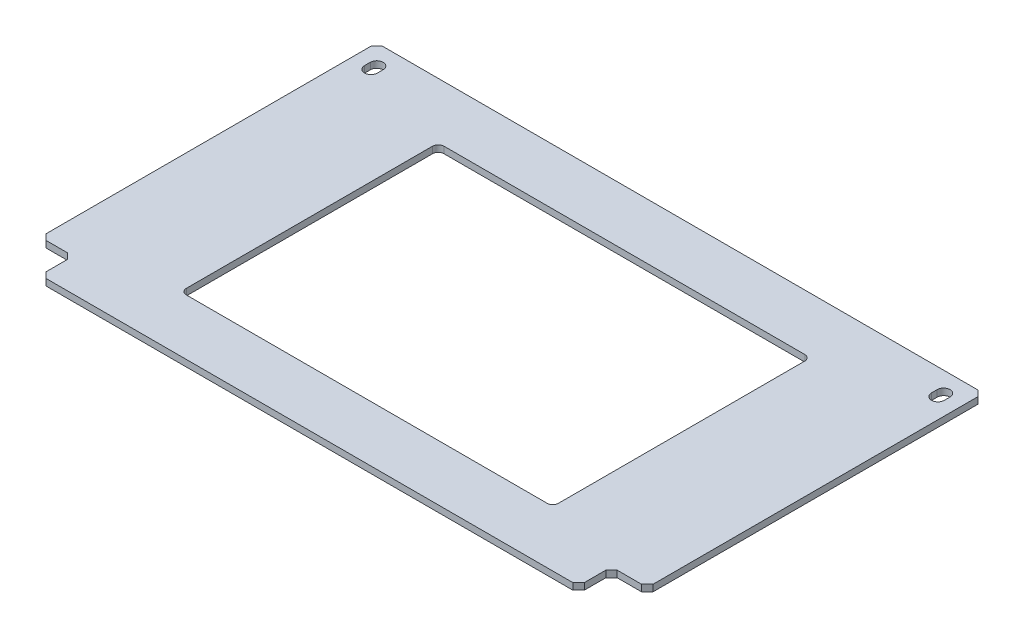
ISO-10303-21;
HEADER;
FILE_DESCRIPTION(('STEP AP214'),'2;1');
FILE_NAME('part.step','',(''),(''),'','','');
FILE_SCHEMA(('AUTOMOTIVE_DESIGN { 1 0 10303 214 1 1 1 1 }'));
ENDSEC;
DATA;
#1=APPLICATION_CONTEXT('core data for automotive mechanical design processes');
#2=APPLICATION_PROTOCOL_DEFINITION('international standard','automotive_design',2000,#1);
#3=PRODUCT_CONTEXT('',#1,'mechanical');
#4=PRODUCT('Part','Part','',(#3));
#5=PRODUCT_RELATED_PRODUCT_CATEGORY('part','',(#4));
#6=PRODUCT_DEFINITION_FORMATION('','',#4);
#7=PRODUCT_DEFINITION_CONTEXT('part definition',#1,'design');
#8=PRODUCT_DEFINITION('design','',#6,#7);
#9=PRODUCT_DEFINITION_SHAPE('','',#8);
#10=(LENGTH_UNIT() NAMED_UNIT(*) SI_UNIT(.MILLI.,.METRE.));
#11=(NAMED_UNIT(*) PLANE_ANGLE_UNIT() SI_UNIT($,.RADIAN.));
#12=(NAMED_UNIT(*) SI_UNIT($,.STERADIAN.) SOLID_ANGLE_UNIT());
#13=UNCERTAINTY_MEASURE_WITH_UNIT(LENGTH_MEASURE(1.E-05),#10,'distance_accuracy_value','');
#14=(GEOMETRIC_REPRESENTATION_CONTEXT(3) GLOBAL_UNCERTAINTY_ASSIGNED_CONTEXT((#13)) GLOBAL_UNIT_ASSIGNED_CONTEXT((#10,
#11,#12)) REPRESENTATION_CONTEXT('',''));
#15=CARTESIAN_POINT('',(0.,0.,0.));
#16=DIRECTION('',(0.,0.,1.));
#17=DIRECTION('',(1.,0.,0.));
#18=AXIS2_PLACEMENT_3D('',#15,#16,#17);
#19=CARTESIAN_POINT('',(101.25,2.5,-122.));
#20=DIRECTION('',(-1.,0.,0.));
#21=DIRECTION('',(0.,0.,-1.));
#22=AXIS2_PLACEMENT_3D('',#19,#20,#21);
#23=PLANE('',#22);
#24=DIRECTION('',(0.,1.,0.));
#25=VECTOR('',#24,1.);
#26=CARTESIAN_POINT('',(101.25,2.5,-122.));
#27=LINE('',#26,#25);
#28=CARTESIAN_POINT('',(101.25,0.2,-122.));
#29=VERTEX_POINT('',#28);
#30=CARTESIAN_POINT('',(101.25,2.5,-122.));
#31=VERTEX_POINT('',#30);
#32=EDGE_CURVE('E429',#29,#31,#27,.T.);
#33=ORIENTED_EDGE('',*,*,#32,.F.);
#34=DIRECTION('',(0.,0.,-1.));
#35=VECTOR('',#34,1.);
#36=CARTESIAN_POINT('',(101.25,0.2,-129.));
#37=LINE('',#36,#35);
#38=CARTESIAN_POINT('',(101.25,0.2,-120.));
#39=VERTEX_POINT('',#38);
#40=EDGE_CURVE('E383',#39,#29,#37,.T.);
#41=ORIENTED_EDGE('',*,*,#40,.F.);
#42=DIRECTION('',(0.,1.,0.));
#43=VECTOR('',#42,1.);
#44=CARTESIAN_POINT('',(101.25,2.5,-120.));
#45=LINE('',#44,#43);
#46=CARTESIAN_POINT('',(101.25,2.5,-120.));
#47=VERTEX_POINT('',#46);
#48=EDGE_CURVE('E427',#39,#47,#45,.T.);
#49=ORIENTED_EDGE('',*,*,#48,.T.);
#50=DIRECTION('',(0.,0.,-1.));
#51=VECTOR('',#50,1.);
#52=CARTESIAN_POINT('',(101.25,2.5,-122.));
#53=LINE('',#52,#51);
#54=EDGE_CURVE('E314',#47,#31,#53,.T.);
#55=ORIENTED_EDGE('',*,*,#54,.T.);
#56=EDGE_LOOP('',(#33,#41,#49,#55));
#57=FACE_BOUND('',#56,.T.);
#58=ADVANCED_FACE('F17',(#57),#23,.T.);
#59=CARTESIAN_POINT('',(99.,2.5,-120.));
#60=DIRECTION('',(0.,1.,0.));
#61=DIRECTION('',(0.,0.,1.));
#62=AXIS2_PLACEMENT_3D('',#59,#60,#61);
#63=CYLINDRICAL_SURFACE('',#62,2.25);
#64=ORIENTED_EDGE('',*,*,#48,.F.);
#65=CARTESIAN_POINT('',(99.,0.2,-120.));
#66=DIRECTION('',(0.,1.,0.));
#67=DIRECTION('',(0.,0.,1.));
#68=AXIS2_PLACEMENT_3D('',#65,#66,#67);
#69=CIRCLE('',#68,2.25);
#70=CARTESIAN_POINT('',(96.75,0.2,-120.));
#71=VERTEX_POINT('',#70);
#72=EDGE_CURVE('E250',#71,#39,#69,.T.);
#73=ORIENTED_EDGE('',*,*,#72,.F.);
#74=DIRECTION('',(0.,1.,0.));
#75=VECTOR('',#74,1.);
#76=CARTESIAN_POINT('',(96.75,2.5,-120.));
#77=LINE('',#76,#75);
#78=CARTESIAN_POINT('',(96.75,2.5,-120.));
#79=VERTEX_POINT('',#78);
#80=EDGE_CURVE('E425',#71,#79,#77,.T.);
#81=ORIENTED_EDGE('',*,*,#80,.T.);
#82=CARTESIAN_POINT('',(99.,2.5,-120.));
#83=DIRECTION('',(0.,1.,0.));
#84=DIRECTION('',(0.,0.,1.));
#85=AXIS2_PLACEMENT_3D('',#82,#83,#84);
#86=CIRCLE('',#85,2.25);
#87=EDGE_CURVE('E239',#79,#47,#86,.T.);
#88=ORIENTED_EDGE('',*,*,#87,.T.);
#89=EDGE_LOOP('',(#64,#73,#81,#88));
#90=FACE_BOUND('',#89,.T.);
#91=ADVANCED_FACE('F516',(#90),#63,.F.);
#92=CARTESIAN_POINT('',(96.75,2.5,-122.));
#93=DIRECTION('',(1.,0.,0.));
#94=DIRECTION('',(0.,0.,1.));
#95=AXIS2_PLACEMENT_3D('',#92,#93,#94);
#96=PLANE('',#95);
#97=ORIENTED_EDGE('',*,*,#80,.F.);
#98=DIRECTION('',(0.,0.,-1.));
#99=VECTOR('',#98,1.);
#100=CARTESIAN_POINT('',(96.75,0.2,-129.));
#101=LINE('',#100,#99);
#102=CARTESIAN_POINT('',(96.75,0.2,-122.));
#103=VERTEX_POINT('',#102);
#104=EDGE_CURVE('E336',#103,#71,#101,.F.);
#105=ORIENTED_EDGE('',*,*,#104,.F.);
#106=DIRECTION('',(0.,1.,0.));
#107=VECTOR('',#106,1.);
#108=CARTESIAN_POINT('',(96.75,2.5,-122.));
#109=LINE('',#108,#107);
#110=CARTESIAN_POINT('',(96.75,2.5,-122.));
#111=VERTEX_POINT('',#110);
#112=EDGE_CURVE('E423',#103,#111,#109,.T.);
#113=ORIENTED_EDGE('',*,*,#112,.T.);
#114=DIRECTION('',(0.,0.,1.));
#115=VECTOR('',#114,1.);
#116=CARTESIAN_POINT('',(96.75,2.5,-122.));
#117=LINE('',#116,#115);
#118=EDGE_CURVE('E308',#111,#79,#117,.T.);
#119=ORIENTED_EDGE('',*,*,#118,.T.);
#120=EDGE_LOOP('',(#97,#105,#113,#119));
#121=FACE_BOUND('',#120,.T.);
#122=ADVANCED_FACE('F523',(#121),#96,.T.);
#123=CARTESIAN_POINT('',(-106.,2.5,0.));
#124=DIRECTION('',(-1.,0.,0.));
#125=DIRECTION('',(0.,0.,-1.));
#126=AXIS2_PLACEMENT_3D('',#123,#124,#125);
#127=PLANE('',#126);
#128=DIRECTION('',(0.,1.,0.));
#129=VECTOR('',#128,1.);
#130=CARTESIAN_POINT('',(-106.,2.5,-127.));
#131=LINE('',#130,#129);
#132=CARTESIAN_POINT('',(-106.,0.2,-127.));
#133=VERTEX_POINT('',#132);
#134=CARTESIAN_POINT('',(-106.,2.5,-127.));
#135=VERTEX_POINT('',#134);
#136=EDGE_CURVE('E421',#133,#135,#131,.T.);
#137=ORIENTED_EDGE('',*,*,#136,.F.);
#138=DIRECTION('',(0.,0.,-1.));
#139=VECTOR('',#138,1.);
#140=CARTESIAN_POINT('',(-106.,0.2,-129.));
#141=LINE('',#140,#139);
#142=CARTESIAN_POINT('',(-106.,0.2,-13.5));
#143=VERTEX_POINT('',#142);
#144=EDGE_CURVE('E373',#143,#133,#141,.T.);
#145=ORIENTED_EDGE('',*,*,#144,.F.);
#146=DIRECTION('',(0.,1.,0.));
#147=VECTOR('',#146,1.);
#148=CARTESIAN_POINT('',(-106.,2.5,-13.5));
#149=LINE('',#148,#147);
#150=CARTESIAN_POINT('',(-106.,2.5,-13.5));
#151=VERTEX_POINT('',#150);
#152=EDGE_CURVE('E419',#143,#151,#149,.T.);
#153=ORIENTED_EDGE('',*,*,#152,.T.);
#154=DIRECTION('',(0.,0.,-1.));
#155=VECTOR('',#154,1.);
#156=CARTESIAN_POINT('',(-106.,2.5,0.));
#157=LINE('',#156,#155);
#158=EDGE_CURVE('E266',#151,#135,#157,.T.);
#159=ORIENTED_EDGE('',*,*,#158,.T.);
#160=EDGE_LOOP('',(#137,#145,#153,#159));
#161=FACE_BOUND('',#160,.T.);
#162=ADVANCED_FACE('F626',(#161),#127,.T.);
#163=CARTESIAN_POINT('',(-106.,2.5,-13.5));
#164=DIRECTION('',(-0.707106781186543,0.,0.707106781186553));
#165=DIRECTION('',(-0.707106781186553,0.,-0.707106781186543));
#166=AXIS2_PLACEMENT_3D('',#163,#164,#165);
#167=PLANE('',#166);
#168=ORIENTED_EDGE('',*,*,#152,.F.);
#169=DIRECTION('',(-0.707106781186553,0.,-0.707106781186543));
#170=VECTOR('',#169,1.);
#171=CARTESIAN_POINT('',(-106.,0.2,-13.5));
#172=LINE('',#171,#170);
#173=CARTESIAN_POINT('',(-104.,0.2,-11.5));
#174=VERTEX_POINT('',#173);
#175=EDGE_CURVE('E370',#143,#174,#172,.F.);
#176=ORIENTED_EDGE('',*,*,#175,.T.);
#177=DIRECTION('',(0.,1.,0.));
#178=VECTOR('',#177,1.);
#179=CARTESIAN_POINT('',(-104.,2.5,-11.5));
#180=LINE('',#179,#178);
#181=CARTESIAN_POINT('',(-104.,2.5,-11.5));
#182=VERTEX_POINT('',#181);
#183=EDGE_CURVE('E417',#174,#182,#180,.T.);
#184=ORIENTED_EDGE('',*,*,#183,.T.);
#185=DIRECTION('',(-0.707106781186553,0.,-0.707106781186543));
#186=VECTOR('',#185,1.);
#187=CARTESIAN_POINT('',(-106.,2.5,-13.5));
#188=LINE('',#187,#186);
#189=EDGE_CURVE('E269',#151,#182,#188,.F.);
#190=ORIENTED_EDGE('',*,*,#189,.F.);
#191=EDGE_LOOP('',(#168,#176,#184,#190));
#192=FACE_BOUND('',#191,.T.);
#193=ADVANCED_FACE('F622',(#192),#167,.T.);
#194=CARTESIAN_POINT('',(-106.,2.5,-11.5));
#195=DIRECTION('',(0.,0.,-1.));
#196=DIRECTION('',(1.,0.,0.));
#197=AXIS2_PLACEMENT_3D('',#194,#195,#196);
#198=PLANE('',#197);
#199=ORIENTED_EDGE('',*,*,#183,.F.);
#200=DIRECTION('',(1.,0.,0.));
#201=VECTOR('',#200,1.);
#202=CARTESIAN_POINT('',(0.,0.2,-11.5));
#203=LINE('',#202,#201);
#204=CARTESIAN_POINT('',(-96.5,0.2,-11.5));
#205=VERTEX_POINT('',#204);
#206=EDGE_CURVE('E367',#174,#205,#203,.T.);
#207=ORIENTED_EDGE('',*,*,#206,.T.);
#208=DIRECTION('',(0.,1.,0.));
#209=VECTOR('',#208,1.);
#210=CARTESIAN_POINT('',(-96.5,2.5,-11.5));
#211=LINE('',#210,#209);
#212=CARTESIAN_POINT('',(-96.5,2.5,-11.5));
#213=VERTEX_POINT('',#212);
#214=EDGE_CURVE('E415',#205,#213,#211,.T.);
#215=ORIENTED_EDGE('',*,*,#214,.T.);
#216=DIRECTION('',(1.,0.,0.));
#217=VECTOR('',#216,1.);
#218=CARTESIAN_POINT('',(-106.,2.5,-11.5));
#219=LINE('',#218,#217);
#220=EDGE_CURVE('E272',#182,#213,#219,.T.);
#221=ORIENTED_EDGE('',*,*,#220,.F.);
#222=EDGE_LOOP('',(#199,#207,#215,#221));
#223=FACE_BOUND('',#222,.T.);
#224=ADVANCED_FACE('F618',(#223),#198,.F.);
#225=CARTESIAN_POINT('',(-106.999999999999,2.5,-21.9999999999984));
#226=DIRECTION('',(-0.707106781186538,0.,0.707106781186557));
#227=DIRECTION('',(-0.707106781186557,0.,-0.707106781186538));
#228=AXIS2_PLACEMENT_3D('',#225,#226,#227);
#229=PLANE('',#228);
#230=ORIENTED_EDGE('',*,*,#214,.F.);
#231=DIRECTION('',(-0.707106781186557,0.,-0.707106781186538));
#232=VECTOR('',#231,1.);
#233=CARTESIAN_POINT('',(-106.999999999999,0.2,-21.9999999999984));
#234=LINE('',#233,#232);
#235=CARTESIAN_POINT('',(-94.5,0.2,-9.5));
#236=VERTEX_POINT('',#235);
#237=EDGE_CURVE('E364',#205,#236,#234,.F.);
#238=ORIENTED_EDGE('',*,*,#237,.T.);
#239=DIRECTION('',(0.,1.,0.));
#240=VECTOR('',#239,1.);
#241=CARTESIAN_POINT('',(-94.5,2.5,-9.5));
#242=LINE('',#241,#240);
#243=CARTESIAN_POINT('',(-94.5,2.5,-9.5));
#244=VERTEX_POINT('',#243);
#245=EDGE_CURVE('E413',#236,#244,#242,.T.);
#246=ORIENTED_EDGE('',*,*,#245,.T.);
#247=DIRECTION('',(-0.707106781186557,0.,-0.707106781186538));
#248=VECTOR('',#247,1.);
#249=CARTESIAN_POINT('',(-106.999999999999,2.5,-21.9999999999984));
#250=LINE('',#249,#248);
#251=EDGE_CURVE('E275',#213,#244,#250,.F.);
#252=ORIENTED_EDGE('',*,*,#251,.F.);
#253=EDGE_LOOP('',(#230,#238,#246,#252));
#254=FACE_BOUND('',#253,.T.);
#255=ADVANCED_FACE('F614',(#254),#229,.T.);
#256=CARTESIAN_POINT('',(-94.5,2.5,-11.5));
#257=DIRECTION('',(1.,0.,0.));
#258=DIRECTION('',(0.,0.,1.));
#259=AXIS2_PLACEMENT_3D('',#256,#257,#258);
#260=PLANE('',#259);
#261=ORIENTED_EDGE('',*,*,#245,.F.);
#262=DIRECTION('',(0.,0.,-1.));
#263=VECTOR('',#262,1.);
#264=CARTESIAN_POINT('',(-94.5,0.2,-129.));
#265=LINE('',#264,#263);
#266=CARTESIAN_POINT('',(-94.5,0.2,-2.));
#267=VERTEX_POINT('',#266);
#268=EDGE_CURVE('E361',#236,#267,#265,.F.);
#269=ORIENTED_EDGE('',*,*,#268,.T.);
#270=DIRECTION('',(0.,1.,0.));
#271=VECTOR('',#270,1.);
#272=CARTESIAN_POINT('',(-94.5,2.5,-2.));
#273=LINE('',#272,#271);
#274=CARTESIAN_POINT('',(-94.5,2.5,-2.));
#275=VERTEX_POINT('',#274);
#276=EDGE_CURVE('E411',#267,#275,#273,.T.);
#277=ORIENTED_EDGE('',*,*,#276,.T.);
#278=DIRECTION('',(0.,0.,1.));
#279=VECTOR('',#278,1.);
#280=CARTESIAN_POINT('',(-94.5,2.5,-11.5));
#281=LINE('',#280,#279);
#282=EDGE_CURVE('E278',#244,#275,#281,.T.);
#283=ORIENTED_EDGE('',*,*,#282,.F.);
#284=EDGE_LOOP('',(#261,#269,#277,#283));
#285=FACE_BOUND('',#284,.T.);
#286=ADVANCED_FACE('F610',(#285),#260,.F.);
#287=CARTESIAN_POINT('',(-94.5,2.5,-2.));
#288=DIRECTION('',(-0.707106781186543,0.,0.707106781186553));
#289=DIRECTION('',(-0.707106781186553,0.,-0.707106781186543));
#290=AXIS2_PLACEMENT_3D('',#287,#288,#289);
#291=PLANE('',#290);
#292=ORIENTED_EDGE('',*,*,#276,.F.);
#293=DIRECTION('',(-0.707106781186553,0.,-0.707106781186543));
#294=VECTOR('',#293,1.);
#295=CARTESIAN_POINT('',(-94.5,0.2,-2.));
#296=LINE('',#295,#294);
#297=CARTESIAN_POINT('',(-92.5,0.2,0.));
#298=VERTEX_POINT('',#297);
#299=EDGE_CURVE('E358',#267,#298,#296,.F.);
#300=ORIENTED_EDGE('',*,*,#299,.T.);
#301=DIRECTION('',(0.,1.,0.));
#302=VECTOR('',#301,1.);
#303=CARTESIAN_POINT('',(-92.5,2.5,0.));
#304=LINE('',#303,#302);
#305=CARTESIAN_POINT('',(-92.5,2.5,0.));
#306=VERTEX_POINT('',#305);
#307=EDGE_CURVE('E409',#298,#306,#304,.T.);
#308=ORIENTED_EDGE('',*,*,#307,.T.);
#309=DIRECTION('',(-0.707106781186553,0.,-0.707106781186543));
#310=VECTOR('',#309,1.);
#311=CARTESIAN_POINT('',(-94.5,2.5,-2.));
#312=LINE('',#311,#310);
#313=EDGE_CURVE('E281',#275,#306,#312,.F.);
#314=ORIENTED_EDGE('',*,*,#313,.F.);
#315=EDGE_LOOP('',(#292,#300,#308,#314));
#316=FACE_BOUND('',#315,.T.);
#317=ADVANCED_FACE('F606',(#316),#291,.T.);
#318=CARTESIAN_POINT('',(0.,2.5,0.));
#319=DIRECTION('',(0.,0.,-1.));
#320=DIRECTION('',(1.,0.,0.));
#321=AXIS2_PLACEMENT_3D('',#318,#319,#320);
#322=PLANE('',#321);
#323=ORIENTED_EDGE('',*,*,#307,.F.);
#324=DIRECTION('',(1.,0.,0.));
#325=VECTOR('',#324,1.);
#326=CARTESIAN_POINT('',(0.,0.2,0.));
#327=LINE('',#326,#325);
#328=CARTESIAN_POINT('',(91.5,0.2,0.));
#329=VERTEX_POINT('',#328);
#330=EDGE_CURVE('E355',#298,#329,#327,.T.);
#331=ORIENTED_EDGE('',*,*,#330,.T.);
#332=DIRECTION('',(0.,1.,0.));
#333=VECTOR('',#332,1.);
#334=CARTESIAN_POINT('',(91.5,2.5,0.));
#335=LINE('',#334,#333);
#336=CARTESIAN_POINT('',(91.5,2.5,0.));
#337=VERTEX_POINT('',#336);
#338=EDGE_CURVE('E407',#329,#337,#335,.T.);
#339=ORIENTED_EDGE('',*,*,#338,.T.);
#340=DIRECTION('',(1.,0.,0.));
#341=VECTOR('',#340,1.);
#342=CARTESIAN_POINT('',(0.,2.5,0.));
#343=LINE('',#342,#341);
#344=EDGE_CURVE('E284',#306,#337,#343,.T.);
#345=ORIENTED_EDGE('',*,*,#344,.F.);
#346=EDGE_LOOP('',(#323,#331,#339,#345));
#347=FACE_BOUND('',#346,.T.);
#348=ADVANCED_FACE('F602',(#347),#322,.F.);
#349=CARTESIAN_POINT('',(91.5,2.5,0.));
#350=DIRECTION('',(0.707106781186557,0.,0.707106781186538));
#351=DIRECTION('',(-0.707106781186538,0.,0.707106781186557));
#352=AXIS2_PLACEMENT_3D('',#349,#350,#351);
#353=PLANE('',#352);
#354=ORIENTED_EDGE('',*,*,#338,.F.);
#355=DIRECTION('',(-0.707106781186538,0.,0.707106781186557));
#356=VECTOR('',#355,1.);
#357=CARTESIAN_POINT('',(91.5,0.2,0.));
#358=LINE('',#357,#356);
#359=CARTESIAN_POINT('',(93.5,0.2,-2.00000000000006));
#360=VERTEX_POINT('',#359);
#361=EDGE_CURVE('E352',#329,#360,#358,.F.);
#362=ORIENTED_EDGE('',*,*,#361,.T.);
#363=DIRECTION('',(0.,1.,0.));
#364=VECTOR('',#363,1.);
#365=CARTESIAN_POINT('',(93.5,2.5,-2.00000000000006));
#366=LINE('',#365,#364);
#367=CARTESIAN_POINT('',(93.5,2.5,-2.00000000000006));
#368=VERTEX_POINT('',#367);
#369=EDGE_CURVE('E405',#360,#368,#366,.T.);
#370=ORIENTED_EDGE('',*,*,#369,.T.);
#371=DIRECTION('',(-0.707106781186538,0.,0.707106781186557));
#372=VECTOR('',#371,1.);
#373=CARTESIAN_POINT('',(91.5,2.5,0.));
#374=LINE('',#373,#372);
#375=EDGE_CURVE('E287',#337,#368,#374,.F.);
#376=ORIENTED_EDGE('',*,*,#375,.F.);
#377=EDGE_LOOP('',(#354,#362,#370,#376));
#378=FACE_BOUND('',#377,.T.);
#379=ADVANCED_FACE('F598',(#378),#353,.T.);
#380=CARTESIAN_POINT('',(93.5,2.5,0.));
#381=DIRECTION('',(1.,0.,0.));
#382=DIRECTION('',(0.,0.,1.));
#383=AXIS2_PLACEMENT_3D('',#380,#381,#382);
#384=PLANE('',#383);
#385=ORIENTED_EDGE('',*,*,#369,.F.);
#386=DIRECTION('',(0.,0.,-1.));
#387=VECTOR('',#386,1.);
#388=CARTESIAN_POINT('',(93.5,0.2,-129.));
#389=LINE('',#388,#387);
#390=CARTESIAN_POINT('',(93.5,0.2,-9.5));
#391=VERTEX_POINT('',#390);
#392=EDGE_CURVE('E349',#391,#360,#389,.F.);
#393=ORIENTED_EDGE('',*,*,#392,.F.);
#394=DIRECTION('',(0.,1.,0.));
#395=VECTOR('',#394,1.);
#396=CARTESIAN_POINT('',(93.5,2.5,-9.5));
#397=LINE('',#396,#395);
#398=CARTESIAN_POINT('',(93.5,2.5,-9.5));
#399=VERTEX_POINT('',#398);
#400=EDGE_CURVE('E403',#391,#399,#397,.T.);
#401=ORIENTED_EDGE('',*,*,#400,.T.);
#402=DIRECTION('',(0.,0.,1.));
#403=VECTOR('',#402,1.);
#404=CARTESIAN_POINT('',(93.5,2.5,0.));
#405=LINE('',#404,#403);
#406=EDGE_CURVE('E290',#399,#368,#405,.T.);
#407=ORIENTED_EDGE('',*,*,#406,.T.);
#408=EDGE_LOOP('',(#385,#393,#401,#407));
#409=FACE_BOUND('',#408,.T.);
#410=ADVANCED_FACE('F594',(#409),#384,.T.);
#411=CARTESIAN_POINT('',(106.5,2.5,-22.5000000000008));
#412=DIRECTION('',(0.707106781186553,0.,0.707106781186543));
#413=DIRECTION('',(-0.707106781186543,0.,0.707106781186553));
#414=AXIS2_PLACEMENT_3D('',#411,#412,#413);
#415=PLANE('',#414);
#416=ORIENTED_EDGE('',*,*,#400,.F.);
#417=DIRECTION('',(-0.707106781186543,0.,0.707106781186553));
#418=VECTOR('',#417,1.);
#419=CARTESIAN_POINT('',(106.5,0.2,-22.5000000000008));
#420=LINE('',#419,#418);
#421=CARTESIAN_POINT('',(95.5,0.2,-11.5));
#422=VERTEX_POINT('',#421);
#423=EDGE_CURVE('E346',#391,#422,#420,.F.);
#424=ORIENTED_EDGE('',*,*,#423,.T.);
#425=DIRECTION('',(0.,1.,0.));
#426=VECTOR('',#425,1.);
#427=CARTESIAN_POINT('',(95.5,2.5,-11.5));
#428=LINE('',#427,#426);
#429=CARTESIAN_POINT('',(95.5,2.5,-11.5));
#430=VERTEX_POINT('',#429);
#431=EDGE_CURVE('E401',#422,#430,#428,.T.);
#432=ORIENTED_EDGE('',*,*,#431,.T.);
#433=DIRECTION('',(-0.707106781186543,0.,0.707106781186553));
#434=VECTOR('',#433,1.);
#435=CARTESIAN_POINT('',(106.5,2.5,-22.5000000000008));
#436=LINE('',#435,#434);
#437=EDGE_CURVE('E293',#399,#430,#436,.F.);
#438=ORIENTED_EDGE('',*,*,#437,.F.);
#439=EDGE_LOOP('',(#416,#424,#432,#438));
#440=FACE_BOUND('',#439,.T.);
#441=ADVANCED_FACE('F590',(#440),#415,.T.);
#442=CARTESIAN_POINT('',(106.,2.5,-11.5));
#443=DIRECTION('',(0.,0.,1.));
#444=DIRECTION('',(-1.,0.,0.));
#445=AXIS2_PLACEMENT_3D('',#442,#443,#444);
#446=PLANE('',#445);
#447=ORIENTED_EDGE('',*,*,#431,.F.);
#448=DIRECTION('',(1.,0.,0.));
#449=VECTOR('',#448,1.);
#450=CARTESIAN_POINT('',(0.,0.2,-11.5));
#451=LINE('',#450,#449);
#452=CARTESIAN_POINT('',(104.,0.2,-11.5));
#453=VERTEX_POINT('',#452);
#454=EDGE_CURVE('E343',#453,#422,#451,.F.);
#455=ORIENTED_EDGE('',*,*,#454,.F.);
#456=DIRECTION('',(0.,1.,0.));
#457=VECTOR('',#456,1.);
#458=CARTESIAN_POINT('',(104.,2.5,-11.5));
#459=LINE('',#458,#457);
#460=CARTESIAN_POINT('',(104.,2.5,-11.5));
#461=VERTEX_POINT('',#460);
#462=EDGE_CURVE('E399',#453,#461,#459,.T.);
#463=ORIENTED_EDGE('',*,*,#462,.T.);
#464=DIRECTION('',(-1.,0.,0.));
#465=VECTOR('',#464,1.);
#466=CARTESIAN_POINT('',(106.,2.5,-11.5));
#467=LINE('',#466,#465);
#468=EDGE_CURVE('E296',#461,#430,#467,.T.);
#469=ORIENTED_EDGE('',*,*,#468,.T.);
#470=EDGE_LOOP('',(#447,#455,#463,#469));
#471=FACE_BOUND('',#470,.T.);
#472=ADVANCED_FACE('F586',(#471),#446,.T.);
#473=CARTESIAN_POINT('',(104.,2.5,-11.5));
#474=DIRECTION('',(0.707106781186557,0.,0.707106781186538));
#475=DIRECTION('',(-0.707106781186538,0.,0.707106781186557));
#476=AXIS2_PLACEMENT_3D('',#473,#474,#475);
#477=PLANE('',#476);
#478=ORIENTED_EDGE('',*,*,#462,.F.);
#479=DIRECTION('',(-0.707106781186538,0.,0.707106781186557));
#480=VECTOR('',#479,1.);
#481=CARTESIAN_POINT('',(104.,0.2,-11.5));
#482=LINE('',#481,#480);
#483=CARTESIAN_POINT('',(106.,0.2,-13.5));
#484=VERTEX_POINT('',#483);
#485=EDGE_CURVE('E340',#453,#484,#482,.F.);
#486=ORIENTED_EDGE('',*,*,#485,.T.);
#487=DIRECTION('',(0.,1.,0.));
#488=VECTOR('',#487,1.);
#489=CARTESIAN_POINT('',(106.,2.5,-13.5));
#490=LINE('',#489,#488);
#491=CARTESIAN_POINT('',(106.,2.5,-13.5));
#492=VERTEX_POINT('',#491);
#493=EDGE_CURVE('E397',#484,#492,#490,.T.);
#494=ORIENTED_EDGE('',*,*,#493,.T.);
#495=DIRECTION('',(-0.707106781186538,0.,0.707106781186557));
#496=VECTOR('',#495,1.);
#497=CARTESIAN_POINT('',(104.,2.5,-11.5));
#498=LINE('',#497,#496);
#499=EDGE_CURVE('E299',#461,#492,#498,.F.);
#500=ORIENTED_EDGE('',*,*,#499,.F.);
#501=EDGE_LOOP('',(#478,#486,#494,#500));
#502=FACE_BOUND('',#501,.T.);
#503=ADVANCED_FACE('F582',(#502),#477,.T.);
#504=CARTESIAN_POINT('',(106.,2.5,0.));
#505=DIRECTION('',(-1.,0.,0.));
#506=DIRECTION('',(0.,0.,-1.));
#507=AXIS2_PLACEMENT_3D('',#504,#505,#506);
#508=PLANE('',#507);
#509=ORIENTED_EDGE('',*,*,#493,.F.);
#510=DIRECTION('',(0.,0.,-1.));
#511=VECTOR('',#510,1.);
#512=CARTESIAN_POINT('',(106.,0.2,-129.));
#513=LINE('',#512,#511);
#514=CARTESIAN_POINT('',(106.,0.2,-127.));
#515=VERTEX_POINT('',#514);
#516=EDGE_CURVE('E337',#484,#515,#513,.T.);
#517=ORIENTED_EDGE('',*,*,#516,.T.);
#518=DIRECTION('',(0.,1.,0.));
#519=VECTOR('',#518,1.);
#520=CARTESIAN_POINT('',(106.,2.5,-127.));
#521=LINE('',#520,#519);
#522=CARTESIAN_POINT('',(106.,2.5,-127.));
#523=VERTEX_POINT('',#522);
#524=EDGE_CURVE('E395',#515,#523,#521,.T.);
#525=ORIENTED_EDGE('',*,*,#524,.T.);
#526=DIRECTION('',(0.,0.,-1.));
#527=VECTOR('',#526,1.);
#528=CARTESIAN_POINT('',(106.,2.5,0.));
#529=LINE('',#528,#527);
#530=EDGE_CURVE('E302',#492,#523,#529,.T.);
#531=ORIENTED_EDGE('',*,*,#530,.F.);
#532=EDGE_LOOP('',(#509,#517,#525,#531));
#533=FACE_BOUND('',#532,.T.);
#534=ADVANCED_FACE('F578',(#533),#508,.F.);
#535=CARTESIAN_POINT('',(104.,2.5,-129.));
#536=DIRECTION('',(0.707106781186557,0.,-0.707106781186538));
#537=DIRECTION('',(0.707106781186538,0.,0.707106781186557));
#538=AXIS2_PLACEMENT_3D('',#535,#536,#537);
#539=PLANE('',#538);
#540=ORIENTED_EDGE('',*,*,#524,.F.);
#541=DIRECTION('',(0.707106781186538,0.,0.707106781186557));
#542=VECTOR('',#541,1.);
#543=CARTESIAN_POINT('',(104.,0.2,-129.));
#544=LINE('',#543,#542);
#545=CARTESIAN_POINT('',(104.,0.2,-129.));
#546=VERTEX_POINT('',#545);
#547=EDGE_CURVE('E333',#515,#546,#544,.F.);
#548=ORIENTED_EDGE('',*,*,#547,.T.);
#549=DIRECTION('',(0.,1.,0.));
#550=VECTOR('',#549,1.);
#551=CARTESIAN_POINT('',(104.,2.5,-129.));
#552=LINE('',#551,#550);
#553=CARTESIAN_POINT('',(104.,2.5,-129.));
#554=VERTEX_POINT('',#553);
#555=EDGE_CURVE('E393',#546,#554,#552,.T.);
#556=ORIENTED_EDGE('',*,*,#555,.T.);
#557=DIRECTION('',(0.707106781186538,0.,0.707106781186557));
#558=VECTOR('',#557,1.);
#559=CARTESIAN_POINT('',(104.,2.5,-129.));
#560=LINE('',#559,#558);
#561=EDGE_CURVE('E305',#523,#554,#560,.F.);
#562=ORIENTED_EDGE('',*,*,#561,.F.);
#563=EDGE_LOOP('',(#540,#548,#556,#562));
#564=FACE_BOUND('',#563,.T.);
#565=ADVANCED_FACE('F574',(#564),#539,.T.);
#566=CARTESIAN_POINT('',(0.,2.5,-129.));
#567=DIRECTION('',(0.,0.,1.));
#568=DIRECTION('',(-1.,0.,0.));
#569=AXIS2_PLACEMENT_3D('',#566,#567,#568);
#570=PLANE('',#569);
#571=ORIENTED_EDGE('',*,*,#555,.F.);
#572=DIRECTION('',(1.,0.,0.));
#573=VECTOR('',#572,1.);
#574=CARTESIAN_POINT('',(0.,0.2,-129.));
#575=LINE('',#574,#573);
#576=CARTESIAN_POINT('',(-104.,0.2,-129.));
#577=VERTEX_POINT('',#576);
#578=EDGE_CURVE('E325',#546,#577,#575,.F.);
#579=ORIENTED_EDGE('',*,*,#578,.T.);
#580=DIRECTION('',(0.,1.,0.));
#581=VECTOR('',#580,1.);
#582=CARTESIAN_POINT('',(-104.,2.5,-129.));
#583=LINE('',#582,#581);
#584=CARTESIAN_POINT('',(-104.,2.5,-129.));
#585=VERTEX_POINT('',#584);
#586=EDGE_CURVE('E391',#577,#585,#583,.T.);
#587=ORIENTED_EDGE('',*,*,#586,.T.);
#588=DIRECTION('',(-1.,0.,0.));
#589=VECTOR('',#588,1.);
#590=CARTESIAN_POINT('',(0.,2.5,-129.));
#591=LINE('',#590,#589);
#592=EDGE_CURVE('E260',#554,#585,#591,.T.);
#593=ORIENTED_EDGE('',*,*,#592,.F.);
#594=EDGE_LOOP('',(#571,#579,#587,#593));
#595=FACE_BOUND('',#594,.T.);
#596=ADVANCED_FACE('F568',(#595),#570,.F.);
#597=CARTESIAN_POINT('',(-101.25,2.5,-122.));
#598=DIRECTION('',(-1.,0.,0.));
#599=DIRECTION('',(0.,0.,-1.));
#600=AXIS2_PLACEMENT_3D('',#597,#598,#599);
#601=PLANE('',#600);
#602=DIRECTION('',(0.,1.,0.));
#603=VECTOR('',#602,1.);
#604=CARTESIAN_POINT('',(-101.25,2.5,-120.));
#605=LINE('',#604,#603);
#606=CARTESIAN_POINT('',(-101.25,0.2,-120.));
#607=VERTEX_POINT('',#606);
#608=CARTESIAN_POINT('',(-101.25,2.5,-120.));
#609=VERTEX_POINT('',#608);
#610=EDGE_CURVE('E253',#607,#609,#605,.T.);
#611=ORIENTED_EDGE('',*,*,#610,.F.);
#612=DIRECTION('',(0.,0.,-1.));
#613=VECTOR('',#612,1.);
#614=CARTESIAN_POINT('',(-101.25,0.2,-129.));
#615=LINE('',#614,#613);
#616=CARTESIAN_POINT('',(-101.25,0.2,-122.));
#617=VERTEX_POINT('',#616);
#618=EDGE_CURVE('E326',#607,#617,#615,.T.);
#619=ORIENTED_EDGE('',*,*,#618,.T.);
#620=DIRECTION('',(0.,1.,0.));
#621=VECTOR('',#620,1.);
#622=CARTESIAN_POINT('',(-101.25,2.5,-122.));
#623=LINE('',#622,#621);
#624=CARTESIAN_POINT('',(-101.25,2.5,-122.));
#625=VERTEX_POINT('',#624);
#626=EDGE_CURVE('E389',#617,#625,#623,.T.);
#627=ORIENTED_EDGE('',*,*,#626,.T.);
#628=DIRECTION('',(0.,0.,-1.));
#629=VECTOR('',#628,1.);
#630=CARTESIAN_POINT('',(-101.25,2.5,-122.));
#631=LINE('',#630,#629);
#632=EDGE_CURVE('E254',#609,#625,#631,.T.);
#633=ORIENTED_EDGE('',*,*,#632,.F.);
#634=EDGE_LOOP('',(#611,#619,#627,#633));
#635=FACE_BOUND('',#634,.T.);
#636=ADVANCED_FACE('F564',(#635),#601,.F.);
#637=CARTESIAN_POINT('',(-99.,2.5,-122.));
#638=DIRECTION('',(0.,-1.,0.));
#639=DIRECTION('',(0.,0.,-1.));
#640=AXIS2_PLACEMENT_3D('',#637,#638,#639);
#641=CYLINDRICAL_SURFACE('',#640,2.25);
#642=ORIENTED_EDGE('',*,*,#626,.F.);
#643=CARTESIAN_POINT('',(-99.,0.2,-122.));
#644=DIRECTION('',(0.,-1.,0.));
#645=DIRECTION('',(0.,0.,-1.));
#646=AXIS2_PLACEMENT_3D('',#643,#644,#645);
#647=CIRCLE('',#646,2.25);
#648=CARTESIAN_POINT('',(-96.75,0.2,-122.));
#649=VERTEX_POINT('',#648);
#650=EDGE_CURVE('E322',#617,#649,#647,.T.);
#651=ORIENTED_EDGE('',*,*,#650,.T.);
#652=DIRECTION('',(0.,1.,0.));
#653=VECTOR('',#652,1.);
#654=CARTESIAN_POINT('',(-96.75,2.5,-122.));
#655=LINE('',#654,#653);
#656=CARTESIAN_POINT('',(-96.75,2.5,-122.));
#657=VERTEX_POINT('',#656);
#658=EDGE_CURVE('E238',#649,#657,#655,.T.);
#659=ORIENTED_EDGE('',*,*,#658,.T.);
#660=CARTESIAN_POINT('',(-99.,2.5,-122.));
#661=DIRECTION('',(0.,-1.,0.));
#662=DIRECTION('',(0.,0.,1.));
#663=AXIS2_PLACEMENT_3D('',#660,#661,#662);
#664=CIRCLE('',#663,2.25);
#665=EDGE_CURVE('E249',#625,#657,#664,.T.);
#666=ORIENTED_EDGE('',*,*,#665,.F.);
#667=EDGE_LOOP('',(#642,#651,#659,#666));
#668=FACE_BOUND('',#667,.T.);
#669=ADVANCED_FACE('F561',(#668),#641,.F.);
#670=CARTESIAN_POINT('',(-96.75,2.5,-122.));
#671=DIRECTION('',(1.,0.,0.));
#672=DIRECTION('',(0.,0.,1.));
#673=AXIS2_PLACEMENT_3D('',#670,#671,#672);
#674=PLANE('',#673);
#675=ORIENTED_EDGE('',*,*,#658,.F.);
#676=DIRECTION('',(0.,0.,-1.));
#677=VECTOR('',#676,1.);
#678=CARTESIAN_POINT('',(-96.75,0.2,-129.));
#679=LINE('',#678,#677);
#680=CARTESIAN_POINT('',(-96.75,0.2,-120.));
#681=VERTEX_POINT('',#680);
#682=EDGE_CURVE('E233',#649,#681,#679,.F.);
#683=ORIENTED_EDGE('',*,*,#682,.T.);
#684=DIRECTION('',(0.,1.,0.));
#685=VECTOR('',#684,1.);
#686=CARTESIAN_POINT('',(-96.75,2.5,-120.));
#687=LINE('',#686,#685);
#688=CARTESIAN_POINT('',(-96.75,2.5,-120.));
#689=VERTEX_POINT('',#688);
#690=EDGE_CURVE('E227',#681,#689,#687,.T.);
#691=ORIENTED_EDGE('',*,*,#690,.T.);
#692=DIRECTION('',(0.,0.,1.));
#693=VECTOR('',#692,1.);
#694=CARTESIAN_POINT('',(-96.75,2.5,-122.));
#695=LINE('',#694,#693);
#696=EDGE_CURVE('E230',#657,#689,#695,.T.);
#697=ORIENTED_EDGE('',*,*,#696,.F.);
#698=EDGE_LOOP('',(#675,#683,#691,#697));
#699=FACE_BOUND('',#698,.T.);
#700=ADVANCED_FACE('F229',(#699),#674,.F.);
#701=CARTESIAN_POINT('',(-99.,2.5,-120.));
#702=DIRECTION('',(0.,-1.,0.));
#703=DIRECTION('',(0.,0.,-1.));
#704=AXIS2_PLACEMENT_3D('',#701,#702,#703);
#705=CYLINDRICAL_SURFACE('',#704,2.25);
#706=CARTESIAN_POINT('',(-99.,0.2,-120.));
#707=DIRECTION('',(0.,-1.,0.));
#708=DIRECTION('',(0.,0.,-1.));
#709=AXIS2_PLACEMENT_3D('',#706,#707,#708);
#710=CIRCLE('',#709,2.25);
#711=EDGE_CURVE('E320',#681,#607,#710,.T.);
#712=ORIENTED_EDGE('',*,*,#711,.T.);
#713=ORIENTED_EDGE('',*,*,#610,.T.);
#714=CARTESIAN_POINT('',(-99.,2.5,-120.));
#715=DIRECTION('',(0.,-1.,0.));
#716=DIRECTION('',(0.,0.,1.));
#717=AXIS2_PLACEMENT_3D('',#714,#715,#716);
#718=CIRCLE('',#717,2.25);
#719=EDGE_CURVE('E246',#689,#609,#718,.T.);
#720=ORIENTED_EDGE('',*,*,#719,.F.);
#721=ORIENTED_EDGE('',*,*,#690,.F.);
#722=EDGE_LOOP('',(#712,#713,#720,#721));
#723=FACE_BOUND('',#722,.T.);
#724=ADVANCED_FACE('F252',(#723),#705,.F.);
#725=CARTESIAN_POINT('',(-106.,2.5,-127.));
#726=DIRECTION('',(-0.707106781186553,0.,-0.707106781186543));
#727=DIRECTION('',(0.707106781186543,0.,-0.707106781186553));
#728=AXIS2_PLACEMENT_3D('',#725,#726,#727);
#729=PLANE('',#728);
#730=DIRECTION('',(0.707106781186543,0.,-0.707106781186553));
#731=VECTOR('',#730,1.);
#732=CARTESIAN_POINT('',(-106.,0.2,-127.));
#733=LINE('',#732,#731);
#734=EDGE_CURVE('E332',#577,#133,#733,.F.);
#735=ORIENTED_EDGE('',*,*,#734,.T.);
#736=ORIENTED_EDGE('',*,*,#136,.T.);
#737=DIRECTION('',(0.707106781186543,0.,-0.707106781186553));
#738=VECTOR('',#737,1.);
#739=CARTESIAN_POINT('',(-106.,2.5,-127.));
#740=LINE('',#739,#738);
#741=EDGE_CURVE('E263',#585,#135,#740,.F.);
#742=ORIENTED_EDGE('',*,*,#741,.F.);
#743=ORIENTED_EDGE('',*,*,#586,.F.);
#744=EDGE_LOOP('',(#735,#736,#742,#743));
#745=FACE_BOUND('',#744,.T.);
#746=ADVANCED_FACE('F531',(#745),#729,.T.);
#747=CARTESIAN_POINT('',(99.,2.5,-122.));
#748=DIRECTION('',(0.,1.,0.));
#749=DIRECTION('',(0.,0.,1.));
#750=AXIS2_PLACEMENT_3D('',#747,#748,#749);
#751=CYLINDRICAL_SURFACE('',#750,2.25);
#752=CARTESIAN_POINT('',(99.,0.2,-122.));
#753=DIRECTION('',(0.,1.,0.));
#754=DIRECTION('',(0.,0.,1.));
#755=AXIS2_PLACEMENT_3D('',#752,#753,#754);
#756=CIRCLE('',#755,2.25);
#757=EDGE_CURVE('E380',#29,#103,#756,.T.);
#758=ORIENTED_EDGE('',*,*,#757,.F.);
#759=ORIENTED_EDGE('',*,*,#32,.T.);
#760=CARTESIAN_POINT('',(99.,2.5,-122.));
#761=DIRECTION('',(0.,1.,0.));
#762=DIRECTION('',(0.,0.,1.));
#763=AXIS2_PLACEMENT_3D('',#760,#761,#762);
#764=CIRCLE('',#763,2.25);
#765=EDGE_CURVE('E311',#31,#111,#764,.T.);
#766=ORIENTED_EDGE('',*,*,#765,.T.);
#767=ORIENTED_EDGE('',*,*,#112,.F.);
#768=EDGE_LOOP('',(#758,#759,#766,#767));
#769=FACE_BOUND('',#768,.T.);
#770=ADVANCED_FACE('F528',(#769),#751,.F.);
#771=CARTESIAN_POINT('',(0.,2.5,-129.));
#772=DIRECTION('',(0.,-1.,0.));
#773=DIRECTION('',(0.,0.,-1.));
#774=AXIS2_PLACEMENT_3D('',#771,#772,#773);
#775=PLANE('',#774);
#776=DIRECTION('',(-1.,0.,0.));
#777=VECTOR('',#776,1.);
#778=CARTESIAN_POINT('',(-65.,2.5,-109.5));
#779=LINE('',#778,#777);
#780=CARTESIAN_POINT('',(63.,2.5,-109.5));
#781=VERTEX_POINT('',#780);
#782=CARTESIAN_POINT('',(-63.,2.5,-109.5));
#783=VERTEX_POINT('',#782);
#784=EDGE_CURVE('E492',#781,#783,#779,.T.);
#785=ORIENTED_EDGE('',*,*,#784,.F.);
#786=CARTESIAN_POINT('',(63.,2.5,-107.5));
#787=DIRECTION('',(0.,-1.,0.));
#788=DIRECTION('',(0.,0.,-1.));
#789=AXIS2_PLACEMENT_3D('',#786,#787,#788);
#790=CIRCLE('',#789,2.);
#791=CARTESIAN_POINT('',(65.,2.5,-107.5));
#792=VERTEX_POINT('',#791);
#793=EDGE_CURVE('E451',#781,#792,#790,.T.);
#794=ORIENTED_EDGE('',*,*,#793,.T.);
#795=DIRECTION('',(0.,0.,-1.));
#796=VECTOR('',#795,1.);
#797=CARTESIAN_POINT('',(65.,2.5,-109.5));
#798=LINE('',#797,#796);
#799=CARTESIAN_POINT('',(65.,2.5,-21.5));
#800=VERTEX_POINT('',#799);
#801=EDGE_CURVE('E467',#800,#792,#798,.T.);
#802=ORIENTED_EDGE('',*,*,#801,.F.);
#803=CARTESIAN_POINT('',(63.,2.5,-21.5));
#804=DIRECTION('',(0.,-1.,0.));
#805=DIRECTION('',(0.,0.,-1.));
#806=AXIS2_PLACEMENT_3D('',#803,#804,#805);
#807=CIRCLE('',#806,2.);
#808=CARTESIAN_POINT('',(63.,2.5,-19.5));
#809=VERTEX_POINT('',#808);
#810=EDGE_CURVE('E25',#800,#809,#807,.T.);
#811=ORIENTED_EDGE('',*,*,#810,.T.);
#812=DIRECTION('',(1.,0.,0.));
#813=VECTOR('',#812,1.);
#814=CARTESIAN_POINT('',(-65.,2.5,-19.5));
#815=LINE('',#814,#813);
#816=CARTESIAN_POINT('',(-63.,2.5,-19.5));
#817=VERTEX_POINT('',#816);
#818=EDGE_CURVE('E465',#817,#809,#815,.T.);
#819=ORIENTED_EDGE('',*,*,#818,.F.);
#820=CARTESIAN_POINT('',(-63.,2.5,-21.5));
#821=DIRECTION('',(0.,-1.,0.));
#822=DIRECTION('',(0.,0.,-1.));
#823=AXIS2_PLACEMENT_3D('',#820,#821,#822);
#824=CIRCLE('',#823,2.);
#825=CARTESIAN_POINT('',(-65.,2.5,-21.5));
#826=VERTEX_POINT('',#825);
#827=EDGE_CURVE('E459',#817,#826,#824,.T.);
#828=ORIENTED_EDGE('',*,*,#827,.T.);
#829=DIRECTION('',(0.,0.,1.));
#830=VECTOR('',#829,1.);
#831=CARTESIAN_POINT('',(-65.,2.5,-109.5));
#832=LINE('',#831,#830);
#833=CARTESIAN_POINT('',(-65.,2.5,-107.5));
#834=VERTEX_POINT('',#833);
#835=EDGE_CURVE('E473',#834,#826,#832,.T.);
#836=ORIENTED_EDGE('',*,*,#835,.F.);
#837=CARTESIAN_POINT('',(-63.,2.5,-107.5));
#838=DIRECTION('',(0.,-1.,0.));
#839=DIRECTION('',(0.,0.,-1.));
#840=AXIS2_PLACEMENT_3D('',#837,#838,#839);
#841=CIRCLE('',#840,2.);
#842=EDGE_CURVE('E455',#834,#783,#841,.T.);
#843=ORIENTED_EDGE('',*,*,#842,.T.);
#844=EDGE_LOOP('',(#785,#794,#802,#811,#819,#828,#836,#843));
#845=FACE_BOUND('',#844,.T.);
#846=ORIENTED_EDGE('',*,*,#696,.T.);
#847=ORIENTED_EDGE('',*,*,#719,.T.);
#848=ORIENTED_EDGE('',*,*,#632,.T.);
#849=ORIENTED_EDGE('',*,*,#665,.T.);
#850=EDGE_LOOP('',(#846,#847,#848,#849));
#851=FACE_BOUND('',#850,.T.);
#852=ORIENTED_EDGE('',*,*,#592,.T.);
#853=ORIENTED_EDGE('',*,*,#741,.T.);
#854=ORIENTED_EDGE('',*,*,#158,.F.);
#855=ORIENTED_EDGE('',*,*,#189,.T.);
#856=ORIENTED_EDGE('',*,*,#220,.T.);
#857=ORIENTED_EDGE('',*,*,#251,.T.);
#858=ORIENTED_EDGE('',*,*,#282,.T.);
#859=ORIENTED_EDGE('',*,*,#313,.T.);
#860=ORIENTED_EDGE('',*,*,#344,.T.);
#861=ORIENTED_EDGE('',*,*,#375,.T.);
#862=ORIENTED_EDGE('',*,*,#406,.F.);
#863=ORIENTED_EDGE('',*,*,#437,.T.);
#864=ORIENTED_EDGE('',*,*,#468,.F.);
#865=ORIENTED_EDGE('',*,*,#499,.T.);
#866=ORIENTED_EDGE('',*,*,#530,.T.);
#867=ORIENTED_EDGE('',*,*,#561,.T.);
#868=EDGE_LOOP('',(#852,#853,#854,#855,#856,#857,#858,#859,#860,#861,#862,#863,#864,#865,#866,#867));
#869=FACE_BOUND('',#868,.T.);
#870=ORIENTED_EDGE('',*,*,#118,.F.);
#871=ORIENTED_EDGE('',*,*,#765,.F.);
#872=ORIENTED_EDGE('',*,*,#54,.F.);
#873=ORIENTED_EDGE('',*,*,#87,.F.);
#874=EDGE_LOOP('',(#870,#871,#872,#873));
#875=FACE_BOUND('',#874,.T.);
#876=ADVANCED_FACE('F243',(#845,#851,#869,#875),#775,.F.);
#877=CARTESIAN_POINT('',(0.,0.2,-129.));
#878=DIRECTION('',(0.,-1.,0.));
#879=DIRECTION('',(0.,0.,-1.));
#880=AXIS2_PLACEMENT_3D('',#877,#878,#879);
#881=PLANE('',#880);
#882=DIRECTION('',(1.,0.,0.));
#883=VECTOR('',#882,1.);
#884=CARTESIAN_POINT('',(-65.,0.2,-19.5));
#885=LINE('',#884,#883);
#886=CARTESIAN_POINT('',(-63.,0.2,-19.5));
#887=VERTEX_POINT('',#886);
#888=CARTESIAN_POINT('',(63.,0.2,-19.5));
#889=VERTEX_POINT('',#888);
#890=EDGE_CURVE('E321',#887,#889,#885,.T.);
#891=ORIENTED_EDGE('',*,*,#890,.T.);
#892=CARTESIAN_POINT('',(63.,0.2,-21.5));
#893=DIRECTION('',(0.,-1.,0.));
#894=DIRECTION('',(0.,0.,-1.));
#895=AXIS2_PLACEMENT_3D('',#892,#893,#894);
#896=CIRCLE('',#895,2.);
#897=CARTESIAN_POINT('',(65.,0.2,-21.5));
#898=VERTEX_POINT('',#897);
#899=EDGE_CURVE('E11',#889,#898,#896,.F.);
#900=ORIENTED_EDGE('',*,*,#899,.T.);
#901=DIRECTION('',(0.,0.,-1.));
#902=VECTOR('',#901,1.);
#903=CARTESIAN_POINT('',(65.,0.2,-109.5));
#904=LINE('',#903,#902);
#905=CARTESIAN_POINT('',(65.,0.2,-107.5));
#906=VERTEX_POINT('',#905);
#907=EDGE_CURVE('E472',#898,#906,#904,.T.);
#908=ORIENTED_EDGE('',*,*,#907,.T.);
#909=CARTESIAN_POINT('',(63.,0.2,-107.5));
#910=DIRECTION('',(0.,-1.,0.));
#911=DIRECTION('',(0.,0.,-1.));
#912=AXIS2_PLACEMENT_3D('',#909,#910,#911);
#913=CIRCLE('',#912,2.);
#914=CARTESIAN_POINT('',(63.,0.2,-109.5));
#915=VERTEX_POINT('',#914);
#916=EDGE_CURVE('E453',#906,#915,#913,.F.);
#917=ORIENTED_EDGE('',*,*,#916,.T.);
#918=DIRECTION('',(-1.,0.,0.));
#919=VECTOR('',#918,1.);
#920=CARTESIAN_POINT('',(-65.,0.2,-109.5));
#921=LINE('',#920,#919);
#922=CARTESIAN_POINT('',(-63.,0.2,-109.5));
#923=VERTEX_POINT('',#922);
#924=EDGE_CURVE('E483',#915,#923,#921,.T.);
#925=ORIENTED_EDGE('',*,*,#924,.T.);
#926=CARTESIAN_POINT('',(-63.,0.2,-107.5));
#927=DIRECTION('',(0.,-1.,0.));
#928=DIRECTION('',(0.,0.,-1.));
#929=AXIS2_PLACEMENT_3D('',#926,#927,#928);
#930=CIRCLE('',#929,2.);
#931=CARTESIAN_POINT('',(-65.,0.2,-107.5));
#932=VERTEX_POINT('',#931);
#933=EDGE_CURVE('E457',#923,#932,#930,.F.);
#934=ORIENTED_EDGE('',*,*,#933,.T.);
#935=DIRECTION('',(0.,0.,1.));
#936=VECTOR('',#935,1.);
#937=CARTESIAN_POINT('',(-65.,0.2,-109.5));
#938=LINE('',#937,#936);
#939=CARTESIAN_POINT('',(-65.,0.2,-21.5));
#940=VERTEX_POINT('',#939);
#941=EDGE_CURVE('E486',#932,#940,#938,.T.);
#942=ORIENTED_EDGE('',*,*,#941,.T.);
#943=CARTESIAN_POINT('',(-63.,0.2,-21.5));
#944=DIRECTION('',(0.,-1.,0.));
#945=DIRECTION('',(0.,0.,-1.));
#946=AXIS2_PLACEMENT_3D('',#943,#944,#945);
#947=CIRCLE('',#946,2.);
#948=EDGE_CURVE('E39',#940,#887,#947,.F.);
#949=ORIENTED_EDGE('',*,*,#948,.T.);
#950=EDGE_LOOP('',(#891,#900,#908,#917,#925,#934,#942,#949));
#951=FACE_BOUND('',#950,.T.);
#952=ORIENTED_EDGE('',*,*,#682,.F.);
#953=ORIENTED_EDGE('',*,*,#650,.F.);
#954=ORIENTED_EDGE('',*,*,#618,.F.);
#955=ORIENTED_EDGE('',*,*,#711,.F.);
#956=EDGE_LOOP('',(#952,#953,#954,#955));
#957=FACE_BOUND('',#956,.T.);
#958=ORIENTED_EDGE('',*,*,#578,.F.);
#959=ORIENTED_EDGE('',*,*,#547,.F.);
#960=ORIENTED_EDGE('',*,*,#516,.F.);
#961=ORIENTED_EDGE('',*,*,#485,.F.);
#962=ORIENTED_EDGE('',*,*,#454,.T.);
#963=ORIENTED_EDGE('',*,*,#423,.F.);
#964=ORIENTED_EDGE('',*,*,#392,.T.);
#965=ORIENTED_EDGE('',*,*,#361,.F.);
#966=ORIENTED_EDGE('',*,*,#330,.F.);
#967=ORIENTED_EDGE('',*,*,#299,.F.);
#968=ORIENTED_EDGE('',*,*,#268,.F.);
#969=ORIENTED_EDGE('',*,*,#237,.F.);
#970=ORIENTED_EDGE('',*,*,#206,.F.);
#971=ORIENTED_EDGE('',*,*,#175,.F.);
#972=ORIENTED_EDGE('',*,*,#144,.T.);
#973=ORIENTED_EDGE('',*,*,#734,.F.);
#974=EDGE_LOOP('',(#958,#959,#960,#961,#962,#963,#964,#965,#966,#967,#968,#969,#970,#971,#972,#973));
#975=FACE_BOUND('',#974,.T.);
#976=ORIENTED_EDGE('',*,*,#104,.T.);
#977=ORIENTED_EDGE('',*,*,#72,.T.);
#978=ORIENTED_EDGE('',*,*,#40,.T.);
#979=ORIENTED_EDGE('',*,*,#757,.T.);
#980=EDGE_LOOP('',(#976,#977,#978,#979));
#981=FACE_BOUND('',#980,.T.);
#982=ADVANCED_FACE('F477',(#951,#957,#975,#981),#881,.T.);
#983=CARTESIAN_POINT('',(65.,0.2,-109.5));
#984=DIRECTION('',(1.,0.,0.));
#985=DIRECTION('',(0.,0.,-1.));
#986=AXIS2_PLACEMENT_3D('',#983,#984,#985);
#987=PLANE('',#986);
#988=ORIENTED_EDGE('',*,*,#801,.T.);
#989=DIRECTION('',(0.,1.,0.));
#990=VECTOR('',#989,1.);
#991=CARTESIAN_POINT('',(65.,0.2,-107.5));
#992=LINE('',#991,#990);
#993=EDGE_CURVE('E440',#792,#906,#992,.F.);
#994=ORIENTED_EDGE('',*,*,#993,.T.);
#995=ORIENTED_EDGE('',*,*,#907,.F.);
#996=DIRECTION('',(0.,1.,0.));
#997=VECTOR('',#996,1.);
#998=CARTESIAN_POINT('',(65.,2.5,-21.5));
#999=LINE('',#998,#997);
#1000=EDGE_CURVE('E437',#898,#800,#999,.T.);
#1001=ORIENTED_EDGE('',*,*,#1000,.T.);
#1002=EDGE_LOOP('',(#988,#994,#995,#1001));
#1003=FACE_BOUND('',#1002,.T.);
#1004=ADVANCED_FACE('F481',(#1003),#987,.F.);
#1005=CARTESIAN_POINT('',(-65.,0.2,-19.5));
#1006=DIRECTION('',(0.,0.,1.));
#1007=DIRECTION('',(1.,0.,0.));
#1008=AXIS2_PLACEMENT_3D('',#1005,#1006,#1007);
#1009=PLANE('',#1008);
#1010=ORIENTED_EDGE('',*,*,#890,.F.);
#1011=DIRECTION('',(0.,1.,0.));
#1012=VECTOR('',#1011,1.);
#1013=CARTESIAN_POINT('',(-63.,2.5,-19.5));
#1014=LINE('',#1013,#1012);
#1015=EDGE_CURVE('E448',#887,#817,#1014,.T.);
#1016=ORIENTED_EDGE('',*,*,#1015,.T.);
#1017=ORIENTED_EDGE('',*,*,#818,.T.);
#1018=DIRECTION('',(0.,1.,0.));
#1019=VECTOR('',#1018,1.);
#1020=CARTESIAN_POINT('',(63.,0.2,-19.5));
#1021=LINE('',#1020,#1019);
#1022=EDGE_CURVE('E32',#809,#889,#1021,.F.);
#1023=ORIENTED_EDGE('',*,*,#1022,.T.);
#1024=EDGE_LOOP('',(#1010,#1016,#1017,#1023));
#1025=FACE_BOUND('',#1024,.T.);
#1026=ADVANCED_FACE('F470',(#1025),#1009,.F.);
#1027=CARTESIAN_POINT('',(-65.,0.2,-109.5));
#1028=DIRECTION('',(-1.,0.,0.));
#1029=DIRECTION('',(0.,0.,1.));
#1030=AXIS2_PLACEMENT_3D('',#1027,#1028,#1029);
#1031=PLANE('',#1030);
#1032=ORIENTED_EDGE('',*,*,#941,.F.);
#1033=DIRECTION('',(0.,1.,0.));
#1034=VECTOR('',#1033,1.);
#1035=CARTESIAN_POINT('',(-65.,2.5,-107.5));
#1036=LINE('',#1035,#1034);
#1037=EDGE_CURVE('E444',#932,#834,#1036,.T.);
#1038=ORIENTED_EDGE('',*,*,#1037,.T.);
#1039=ORIENTED_EDGE('',*,*,#835,.T.);
#1040=DIRECTION('',(0.,1.,0.));
#1041=VECTOR('',#1040,1.);
#1042=CARTESIAN_POINT('',(-65.,0.2,-21.5));
#1043=LINE('',#1042,#1041);
#1044=EDGE_CURVE('E442',#826,#940,#1043,.F.);
#1045=ORIENTED_EDGE('',*,*,#1044,.T.);
#1046=EDGE_LOOP('',(#1032,#1038,#1039,#1045));
#1047=FACE_BOUND('',#1046,.T.);
#1048=ADVANCED_FACE('F500',(#1047),#1031,.F.);
#1049=CARTESIAN_POINT('',(-65.,0.2,-109.5));
#1050=DIRECTION('',(0.,0.,-1.));
#1051=DIRECTION('',(-1.,0.,0.));
#1052=AXIS2_PLACEMENT_3D('',#1049,#1050,#1051);
#1053=PLANE('',#1052);
#1054=ORIENTED_EDGE('',*,*,#924,.F.);
#1055=DIRECTION('',(0.,1.,0.));
#1056=VECTOR('',#1055,1.);
#1057=CARTESIAN_POINT('',(63.,2.5,-109.5));
#1058=LINE('',#1057,#1056);
#1059=EDGE_CURVE('E434',#915,#781,#1058,.T.);
#1060=ORIENTED_EDGE('',*,*,#1059,.T.);
#1061=ORIENTED_EDGE('',*,*,#784,.T.);
#1062=DIRECTION('',(0.,1.,0.));
#1063=VECTOR('',#1062,1.);
#1064=CARTESIAN_POINT('',(-63.,0.2,-109.5));
#1065=LINE('',#1064,#1063);
#1066=EDGE_CURVE('E431',#783,#923,#1065,.F.);
#1067=ORIENTED_EDGE('',*,*,#1066,.T.);
#1068=EDGE_LOOP('',(#1054,#1060,#1061,#1067));
#1069=FACE_BOUND('',#1068,.T.);
#1070=ADVANCED_FACE('F534',(#1069),#1053,.F.);
#1071=CARTESIAN_POINT('',(63.,0.2,-107.5));
#1072=DIRECTION('',(0.,-1.,0.));
#1073=DIRECTION('',(0.,0.,-1.));
#1074=AXIS2_PLACEMENT_3D('',#1071,#1072,#1073);
#1075=CYLINDRICAL_SURFACE('',#1074,2.);
#1076=ORIENTED_EDGE('',*,*,#916,.F.);
#1077=ORIENTED_EDGE('',*,*,#993,.F.);
#1078=ORIENTED_EDGE('',*,*,#793,.F.);
#1079=ORIENTED_EDGE('',*,*,#1059,.F.);
#1080=EDGE_LOOP('',(#1076,#1077,#1078,#1079));
#1081=FACE_BOUND('',#1080,.T.);
#1082=ADVANCED_FACE('F512',(#1081),#1075,.F.);
#1083=CARTESIAN_POINT('',(-63.,0.2,-107.5));
#1084=DIRECTION('',(0.,-1.,0.));
#1085=DIRECTION('',(0.,0.,-1.));
#1086=AXIS2_PLACEMENT_3D('',#1083,#1084,#1085);
#1087=CYLINDRICAL_SURFACE('',#1086,2.);
#1088=ORIENTED_EDGE('',*,*,#933,.F.);
#1089=ORIENTED_EDGE('',*,*,#1066,.F.);
#1090=ORIENTED_EDGE('',*,*,#842,.F.);
#1091=ORIENTED_EDGE('',*,*,#1037,.F.);
#1092=EDGE_LOOP('',(#1088,#1089,#1090,#1091));
#1093=FACE_BOUND('',#1092,.T.);
#1094=ADVANCED_FACE('F505',(#1093),#1087,.F.);
#1095=CARTESIAN_POINT('',(-63.,0.2,-21.5));
#1096=DIRECTION('',(0.,-1.,0.));
#1097=DIRECTION('',(0.,0.,-1.));
#1098=AXIS2_PLACEMENT_3D('',#1095,#1096,#1097);
#1099=CYLINDRICAL_SURFACE('',#1098,2.);
#1100=ORIENTED_EDGE('',*,*,#948,.F.);
#1101=ORIENTED_EDGE('',*,*,#1044,.F.);
#1102=ORIENTED_EDGE('',*,*,#827,.F.);
#1103=ORIENTED_EDGE('',*,*,#1015,.F.);
#1104=EDGE_LOOP('',(#1100,#1101,#1102,#1103));
#1105=FACE_BOUND('',#1104,.T.);
#1106=ADVANCED_FACE('F503',(#1105),#1099,.F.);
#1107=CARTESIAN_POINT('',(63.,0.2,-21.5));
#1108=DIRECTION('',(0.,-1.,0.));
#1109=DIRECTION('',(0.,0.,-1.));
#1110=AXIS2_PLACEMENT_3D('',#1107,#1108,#1109);
#1111=CYLINDRICAL_SURFACE('',#1110,2.);
#1112=ORIENTED_EDGE('',*,*,#899,.F.);
#1113=ORIENTED_EDGE('',*,*,#1022,.F.);
#1114=ORIENTED_EDGE('',*,*,#810,.F.);
#1115=ORIENTED_EDGE('',*,*,#1000,.F.);
#1116=EDGE_LOOP('',(#1112,#1113,#1114,#1115));
#1117=FACE_BOUND('',#1116,.T.);
#1118=ADVANCED_FACE('F19',(#1117),#1111,.F.);
#1119=CLOSED_SHELL('',(#58,#91,#122,#162,#193,#224,#255,#286,#317,#348,#379,#410,#441,#472,#503,
#534,#565,#596,#636,#669,#700,#724,#746,#770,#876,#982,#1004,#1026,#1048,#1070,#1082,#1094,
#1106,#1118));
#1120=MANIFOLD_SOLID_BREP('B1',#1119);
#1121=ADVANCED_BREP_SHAPE_REPRESENTATION('',(#18,#1120),#14);
#1122=SHAPE_DEFINITION_REPRESENTATION(#9,#1121);
ENDSEC;
END-ISO-10303-21;
